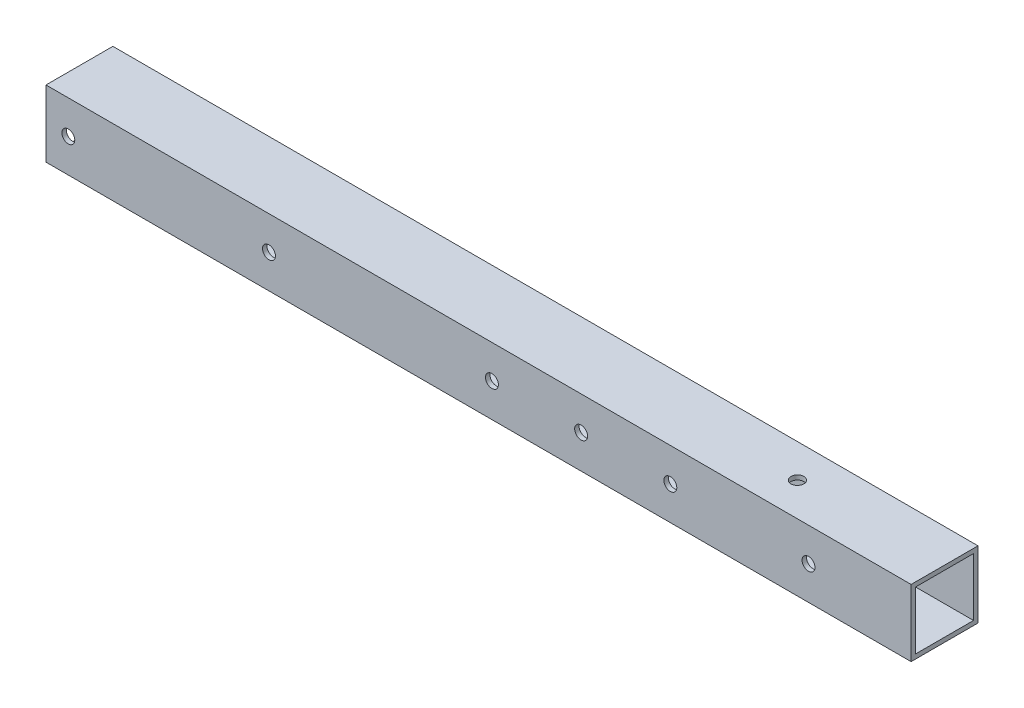
ISO-10303-21;
HEADER;
FILE_DESCRIPTION(('STEP AP214'),'2;1');
FILE_NAME('part.step','',(''),(''),'','','');
FILE_SCHEMA(('AUTOMOTIVE_DESIGN { 1 0 10303 214 1 1 1 1 }'));
ENDSEC;
DATA;
#1=APPLICATION_CONTEXT('core data for automotive mechanical design processes');
#2=APPLICATION_PROTOCOL_DEFINITION('international standard','automotive_design',2000,#1);
#3=PRODUCT_CONTEXT('',#1,'mechanical');
#4=PRODUCT('Part','Part','',(#3));
#5=PRODUCT_RELATED_PRODUCT_CATEGORY('part','',(#4));
#6=PRODUCT_DEFINITION_FORMATION('','',#4);
#7=PRODUCT_DEFINITION_CONTEXT('part definition',#1,'design');
#8=PRODUCT_DEFINITION('design','',#6,#7);
#9=PRODUCT_DEFINITION_SHAPE('','',#8);
#10=(LENGTH_UNIT() NAMED_UNIT(*) SI_UNIT(.MILLI.,.METRE.));
#11=(NAMED_UNIT(*) PLANE_ANGLE_UNIT() SI_UNIT($,.RADIAN.));
#12=(NAMED_UNIT(*) SI_UNIT($,.STERADIAN.) SOLID_ANGLE_UNIT());
#13=UNCERTAINTY_MEASURE_WITH_UNIT(LENGTH_MEASURE(1.E-05),#10,'distance_accuracy_value','');
#14=(GEOMETRIC_REPRESENTATION_CONTEXT(3) GLOBAL_UNCERTAINTY_ASSIGNED_CONTEXT((#13)) GLOBAL_UNIT_ASSIGNED_CONTEXT((#10,
#11,#12)) REPRESENTATION_CONTEXT('',''));
#15=CARTESIAN_POINT('',(0.,0.,0.));
#16=DIRECTION('',(0.,0.,1.));
#17=DIRECTION('',(1.,0.,0.));
#18=AXIS2_PLACEMENT_3D('',#15,#16,#17);
#19=CARTESIAN_POINT('',(194.,-6.50000000000001,-6.49999999999999));
#20=DIRECTION('',(0.,0.,1.));
#21=DIRECTION('',(1.,0.,0.));
#22=AXIS2_PLACEMENT_3D('',#19,#20,#21);
#23=PLANE('',#22);
#24=CARTESIAN_POINT('',(100.,0.,-6.49999999999999));
#25=DIRECTION('',(0.,0.,1.));
#26=DIRECTION('',(1.,0.,0.));
#27=AXIS2_PLACEMENT_3D('',#24,#25,#26);
#28=CIRCLE('',#27,1.45);
#29=CARTESIAN_POINT('',(101.45,0.,-6.49999999999999));
#30=VERTEX_POINT('',#29);
#31=EDGE_CURVE('E293',#30,#30,#28,.T.);
#32=ORIENTED_EDGE('',*,*,#31,.F.);
#33=EDGE_LOOP('',(#32));
#34=FACE_BOUND('',#33,.T.);
#35=CARTESIAN_POINT('',(140.,0.,-6.49999999999999));
#36=DIRECTION('',(0.,0.,1.));
#37=DIRECTION('',(1.,0.,0.));
#38=AXIS2_PLACEMENT_3D('',#35,#36,#37);
#39=CIRCLE('',#38,1.45);
#40=CARTESIAN_POINT('',(141.45,0.,-6.49999999999999));
#41=VERTEX_POINT('',#40);
#42=EDGE_CURVE('E304',#41,#41,#39,.T.);
#43=ORIENTED_EDGE('',*,*,#42,.F.);
#44=EDGE_LOOP('',(#43));
#45=FACE_BOUND('',#44,.T.);
#46=CARTESIAN_POINT('',(120.,0.,-6.49999999999999));
#47=DIRECTION('',(0.,0.,1.));
#48=DIRECTION('',(1.,0.,0.));
#49=AXIS2_PLACEMENT_3D('',#46,#47,#48);
#50=CIRCLE('',#49,1.45);
#51=CARTESIAN_POINT('',(121.45,0.,-6.49999999999999));
#52=VERTEX_POINT('',#51);
#53=EDGE_CURVE('E312',#52,#52,#50,.T.);
#54=ORIENTED_EDGE('',*,*,#53,.F.);
#55=EDGE_LOOP('',(#54));
#56=FACE_BOUND('',#55,.T.);
#57=CARTESIAN_POINT('',(171.,0.,-6.49999999999999));
#58=DIRECTION('',(0.,0.,1.));
#59=DIRECTION('',(1.,0.,0.));
#60=AXIS2_PLACEMENT_3D('',#57,#58,#59);
#61=CIRCLE('',#60,1.45);
#62=CARTESIAN_POINT('',(172.45,0.,-6.49999999999999));
#63=VERTEX_POINT('',#62);
#64=EDGE_CURVE('E258',#63,#63,#61,.T.);
#65=ORIENTED_EDGE('',*,*,#64,.F.);
#66=EDGE_LOOP('',(#65));
#67=FACE_BOUND('',#66,.T.);
#68=CARTESIAN_POINT('',(5.,0.,-6.49999999999999));
#69=DIRECTION('',(0.,0.,1.));
#70=DIRECTION('',(1.,0.,0.));
#71=AXIS2_PLACEMENT_3D('',#68,#69,#70);
#72=CIRCLE('',#71,1.45);
#73=CARTESIAN_POINT('',(6.45,0.,-6.49999999999999));
#74=VERTEX_POINT('',#73);
#75=EDGE_CURVE('E168',#74,#74,#72,.T.);
#76=ORIENTED_EDGE('',*,*,#75,.F.);
#77=EDGE_LOOP('',(#76));
#78=FACE_BOUND('',#77,.T.);
#79=CARTESIAN_POINT('',(50.,0.,-6.49999999999999));
#80=DIRECTION('',(0.,0.,1.));
#81=DIRECTION('',(1.,0.,0.));
#82=AXIS2_PLACEMENT_3D('',#79,#80,#81);
#83=CIRCLE('',#82,1.45);
#84=CARTESIAN_POINT('',(51.45,0.,-6.49999999999999));
#85=VERTEX_POINT('',#84);
#86=EDGE_CURVE('E244',#85,#85,#83,.T.);
#87=ORIENTED_EDGE('',*,*,#86,.F.);
#88=EDGE_LOOP('',(#87));
#89=FACE_BOUND('',#88,.T.);
#90=DIRECTION('',(0.,1.,0.));
#91=VECTOR('',#90,1.);
#92=CARTESIAN_POINT('',(0.,-6.50000000000001,-6.49999999999999));
#93=LINE('',#92,#91);
#94=CARTESIAN_POINT('',(0.,-6.50000000000001,-6.49999999999999));
#95=VERTEX_POINT('',#94);
#96=CARTESIAN_POINT('',(0.,6.49999999999999,-6.49999999999999));
#97=VERTEX_POINT('',#96);
#98=EDGE_CURVE('E177',#95,#97,#93,.T.);
#99=ORIENTED_EDGE('',*,*,#98,.F.);
#100=DIRECTION('',(-1.,0.,0.));
#101=VECTOR('',#100,1.);
#102=CARTESIAN_POINT('',(194.,-6.50000000000001,-6.49999999999999));
#103=LINE('',#102,#101);
#104=CARTESIAN_POINT('',(194.,-6.50000000000001,-6.49999999999999));
#105=VERTEX_POINT('',#104);
#106=EDGE_CURVE('E12',#105,#95,#103,.T.);
#107=ORIENTED_EDGE('',*,*,#106,.F.);
#108=DIRECTION('',(0.,1.,0.));
#109=VECTOR('',#108,1.);
#110=CARTESIAN_POINT('',(194.,-6.50000000000001,-6.49999999999999));
#111=LINE('',#110,#109);
#112=CARTESIAN_POINT('',(194.,6.49999999999999,-6.49999999999999));
#113=VERTEX_POINT('',#112);
#114=EDGE_CURVE('E151',#105,#113,#111,.T.);
#115=ORIENTED_EDGE('',*,*,#114,.T.);
#116=DIRECTION('',(-1.,0.,0.));
#117=VECTOR('',#116,1.);
#118=CARTESIAN_POINT('',(194.,6.49999999999999,-6.49999999999999));
#119=LINE('',#118,#117);
#120=EDGE_CURVE('E81',#113,#97,#119,.T.);
#121=ORIENTED_EDGE('',*,*,#120,.T.);
#122=EDGE_LOOP('',(#99,#107,#115,#121));
#123=FACE_BOUND('',#122,.T.);
#124=ADVANCED_FACE('F61',(#34,#45,#56,#67,#78,#89,#123),#23,.T.);
#125=CARTESIAN_POINT('',(194.,-6.50000000000001,6.50000000000001));
#126=DIRECTION('',(0.,1.,0.));
#127=DIRECTION('',(0.,0.,1.));
#128=AXIS2_PLACEMENT_3D('',#125,#126,#127);
#129=PLANE('',#128);
#130=CARTESIAN_POINT('',(161.,-6.50000000000001,0.));
#131=DIRECTION('',(0.,1.,0.));
#132=DIRECTION('',(0.,0.,1.));
#133=AXIS2_PLACEMENT_3D('',#130,#131,#132);
#134=CIRCLE('',#133,1.45);
#135=CARTESIAN_POINT('',(161.,-6.50000000000001,1.45));
#136=VERTEX_POINT('',#135);
#137=EDGE_CURVE('E281',#136,#136,#134,.T.);
#138=ORIENTED_EDGE('',*,*,#137,.F.);
#139=EDGE_LOOP('',(#138));
#140=FACE_BOUND('',#139,.T.);
#141=DIRECTION('',(0.,0.,-1.));
#142=VECTOR('',#141,1.);
#143=CARTESIAN_POINT('',(0.,-6.50000000000001,6.50000000000001));
#144=LINE('',#143,#142);
#145=CARTESIAN_POINT('',(0.,-6.50000000000001,6.50000000000001));
#146=VERTEX_POINT('',#145);
#147=EDGE_CURVE('E139',#146,#95,#144,.T.);
#148=ORIENTED_EDGE('',*,*,#147,.F.);
#149=DIRECTION('',(-1.,0.,0.));
#150=VECTOR('',#149,1.);
#151=CARTESIAN_POINT('',(194.,-6.50000000000001,6.50000000000001));
#152=LINE('',#151,#150);
#153=CARTESIAN_POINT('',(194.,-6.50000000000001,6.50000000000001));
#154=VERTEX_POINT('',#153);
#155=EDGE_CURVE('E72',#154,#146,#152,.T.);
#156=ORIENTED_EDGE('',*,*,#155,.F.);
#157=DIRECTION('',(0.,0.,-1.));
#158=VECTOR('',#157,1.);
#159=CARTESIAN_POINT('',(194.,-6.50000000000001,6.50000000000001));
#160=LINE('',#159,#158);
#161=EDGE_CURVE('E137',#154,#105,#160,.T.);
#162=ORIENTED_EDGE('',*,*,#161,.T.);
#163=ORIENTED_EDGE('',*,*,#106,.T.);
#164=EDGE_LOOP('',(#148,#156,#162,#163));
#165=FACE_BOUND('',#164,.T.);
#166=ADVANCED_FACE('F136',(#140,#165),#129,.T.);
#167=CARTESIAN_POINT('',(194.,-6.50000000000001,6.50000000000001));
#168=DIRECTION('',(0.,0.,-1.));
#169=DIRECTION('',(-1.,0.,0.));
#170=AXIS2_PLACEMENT_3D('',#167,#168,#169);
#171=PLANE('',#170);
#172=CARTESIAN_POINT('',(100.,0.,6.50000000000001));
#173=DIRECTION('',(0.,0.,-1.));
#174=DIRECTION('',(-1.,0.,0.));
#175=AXIS2_PLACEMENT_3D('',#172,#173,#174);
#176=CIRCLE('',#175,1.45);
#177=CARTESIAN_POINT('',(98.55,0.,6.50000000000001));
#178=VERTEX_POINT('',#177);
#179=EDGE_CURVE('E300',#178,#178,#176,.T.);
#180=ORIENTED_EDGE('',*,*,#179,.F.);
#181=EDGE_LOOP('',(#180));
#182=FACE_BOUND('',#181,.T.);
#183=CARTESIAN_POINT('',(140.,0.,6.50000000000001));
#184=DIRECTION('',(0.,0.,-1.));
#185=DIRECTION('',(-1.,0.,0.));
#186=AXIS2_PLACEMENT_3D('',#183,#184,#185);
#187=CIRCLE('',#186,1.45);
#188=CARTESIAN_POINT('',(138.55,0.,6.50000000000001));
#189=VERTEX_POINT('',#188);
#190=EDGE_CURVE('E308',#189,#189,#187,.T.);
#191=ORIENTED_EDGE('',*,*,#190,.F.);
#192=EDGE_LOOP('',(#191));
#193=FACE_BOUND('',#192,.T.);
#194=CARTESIAN_POINT('',(120.,0.,6.50000000000001));
#195=DIRECTION('',(0.,0.,-1.));
#196=DIRECTION('',(-1.,0.,0.));
#197=AXIS2_PLACEMENT_3D('',#194,#195,#196);
#198=CIRCLE('',#197,1.45);
#199=CARTESIAN_POINT('',(118.55,0.,6.50000000000001));
#200=VERTEX_POINT('',#199);
#201=EDGE_CURVE('E316',#200,#200,#198,.T.);
#202=ORIENTED_EDGE('',*,*,#201,.F.);
#203=EDGE_LOOP('',(#202));
#204=FACE_BOUND('',#203,.T.);
#205=CARTESIAN_POINT('',(171.,0.,6.50000000000001));
#206=DIRECTION('',(0.,0.,-1.));
#207=DIRECTION('',(-1.,0.,0.));
#208=AXIS2_PLACEMENT_3D('',#205,#206,#207);
#209=CIRCLE('',#208,1.45);
#210=CARTESIAN_POINT('',(169.55,0.,6.50000000000001));
#211=VERTEX_POINT('',#210);
#212=EDGE_CURVE('E272',#211,#211,#209,.T.);
#213=ORIENTED_EDGE('',*,*,#212,.F.);
#214=EDGE_LOOP('',(#213));
#215=FACE_BOUND('',#214,.T.);
#216=CARTESIAN_POINT('',(5.,0.,6.50000000000001));
#217=DIRECTION('',(0.,0.,-1.));
#218=DIRECTION('',(-1.,0.,0.));
#219=AXIS2_PLACEMENT_3D('',#216,#217,#218);
#220=CIRCLE('',#219,1.45);
#221=CARTESIAN_POINT('',(3.55,0.,6.50000000000001));
#222=VERTEX_POINT('',#221);
#223=EDGE_CURVE('E240',#222,#222,#220,.T.);
#224=ORIENTED_EDGE('',*,*,#223,.F.);
#225=EDGE_LOOP('',(#224));
#226=FACE_BOUND('',#225,.T.);
#227=CARTESIAN_POINT('',(50.,0.,6.50000000000001));
#228=DIRECTION('',(0.,0.,-1.));
#229=DIRECTION('',(-1.,0.,0.));
#230=AXIS2_PLACEMENT_3D('',#227,#228,#229);
#231=CIRCLE('',#230,1.45);
#232=CARTESIAN_POINT('',(48.55,0.,6.50000000000001));
#233=VERTEX_POINT('',#232);
#234=EDGE_CURVE('E248',#233,#233,#231,.T.);
#235=ORIENTED_EDGE('',*,*,#234,.F.);
#236=EDGE_LOOP('',(#235));
#237=FACE_BOUND('',#236,.T.);
#238=DIRECTION('',(0.,-1.,0.));
#239=VECTOR('',#238,1.);
#240=CARTESIAN_POINT('',(0.,-6.50000000000001,6.50000000000001));
#241=LINE('',#240,#239);
#242=CARTESIAN_POINT('',(0.,6.49999999999999,6.50000000000001));
#243=VERTEX_POINT('',#242);
#244=EDGE_CURVE('E182',#243,#146,#241,.T.);
#245=ORIENTED_EDGE('',*,*,#244,.F.);
#246=DIRECTION('',(-1.,0.,0.));
#247=VECTOR('',#246,1.);
#248=CARTESIAN_POINT('',(194.,6.49999999999999,6.50000000000001));
#249=LINE('',#248,#247);
#250=CARTESIAN_POINT('',(194.,6.49999999999999,6.50000000000001));
#251=VERTEX_POINT('',#250);
#252=EDGE_CURVE('E106',#251,#243,#249,.T.);
#253=ORIENTED_EDGE('',*,*,#252,.F.);
#254=DIRECTION('',(0.,-1.,0.));
#255=VECTOR('',#254,1.);
#256=CARTESIAN_POINT('',(194.,-6.50000000000001,6.50000000000001));
#257=LINE('',#256,#255);
#258=EDGE_CURVE('E150',#251,#154,#257,.T.);
#259=ORIENTED_EDGE('',*,*,#258,.T.);
#260=ORIENTED_EDGE('',*,*,#155,.T.);
#261=EDGE_LOOP('',(#245,#253,#259,#260));
#262=FACE_BOUND('',#261,.T.);
#263=ADVANCED_FACE('F154',(#182,#193,#204,#215,#226,#237,#262),#171,.T.);
#264=CARTESIAN_POINT('',(194.,-7.50000000000001,-7.49999999999999));
#265=DIRECTION('',(0.,0.,1.));
#266=DIRECTION('',(1.,0.,0.));
#267=AXIS2_PLACEMENT_3D('',#264,#265,#266);
#268=PLANE('',#267);
#269=CARTESIAN_POINT('',(100.,0.,-7.49999999999999));
#270=DIRECTION('',(0.,0.,-1.));
#271=DIRECTION('',(-1.,0.,0.));
#272=AXIS2_PLACEMENT_3D('',#269,#270,#271);
#273=CIRCLE('',#272,1.45);
#274=CARTESIAN_POINT('',(98.55,0.,-7.49999999999999));
#275=VERTEX_POINT('',#274);
#276=EDGE_CURVE('E333',#275,#275,#273,.T.);
#277=ORIENTED_EDGE('',*,*,#276,.F.);
#278=EDGE_LOOP('',(#277));
#279=FACE_BOUND('',#278,.T.);
#280=CARTESIAN_POINT('',(140.,0.,-7.49999999999999));
#281=DIRECTION('',(0.,0.,-1.));
#282=DIRECTION('',(-1.,0.,0.));
#283=AXIS2_PLACEMENT_3D('',#280,#281,#282);
#284=CIRCLE('',#283,1.45);
#285=CARTESIAN_POINT('',(138.55,0.,-7.49999999999999));
#286=VERTEX_POINT('',#285);
#287=EDGE_CURVE('E325',#286,#286,#284,.T.);
#288=ORIENTED_EDGE('',*,*,#287,.F.);
#289=EDGE_LOOP('',(#288));
#290=FACE_BOUND('',#289,.T.);
#291=CARTESIAN_POINT('',(120.,0.,-7.49999999999999));
#292=DIRECTION('',(0.,0.,-1.));
#293=DIRECTION('',(-1.,0.,0.));
#294=AXIS2_PLACEMENT_3D('',#291,#292,#293);
#295=CIRCLE('',#294,1.45);
#296=CARTESIAN_POINT('',(118.55,0.,-7.49999999999999));
#297=VERTEX_POINT('',#296);
#298=EDGE_CURVE('E321',#297,#297,#295,.T.);
#299=ORIENTED_EDGE('',*,*,#298,.F.);
#300=EDGE_LOOP('',(#299));
#301=FACE_BOUND('',#300,.T.);
#302=CARTESIAN_POINT('',(171.,0.,-7.49999999999999));
#303=DIRECTION('',(0.,0.,-1.));
#304=DIRECTION('',(-1.,0.,0.));
#305=AXIS2_PLACEMENT_3D('',#302,#303,#304);
#306=CIRCLE('',#305,1.45);
#307=CARTESIAN_POINT('',(169.55,0.,-7.49999999999999));
#308=VERTEX_POINT('',#307);
#309=EDGE_CURVE('E277',#308,#308,#306,.T.);
#310=ORIENTED_EDGE('',*,*,#309,.F.);
#311=EDGE_LOOP('',(#310));
#312=FACE_BOUND('',#311,.T.);
#313=CARTESIAN_POINT('',(5.,0.,-7.49999999999999));
#314=DIRECTION('',(0.,0.,-1.));
#315=DIRECTION('',(-1.,0.,0.));
#316=AXIS2_PLACEMENT_3D('',#313,#314,#315);
#317=CIRCLE('',#316,1.45);
#318=CARTESIAN_POINT('',(3.55,0.,-7.49999999999999));
#319=VERTEX_POINT('',#318);
#320=EDGE_CURVE('E262',#319,#319,#317,.T.);
#321=ORIENTED_EDGE('',*,*,#320,.F.);
#322=EDGE_LOOP('',(#321));
#323=FACE_BOUND('',#322,.T.);
#324=CARTESIAN_POINT('',(50.,0.,-7.49999999999999));
#325=DIRECTION('',(0.,0.,-1.));
#326=DIRECTION('',(-1.,0.,0.));
#327=AXIS2_PLACEMENT_3D('',#324,#325,#326);
#328=CIRCLE('',#327,1.45);
#329=CARTESIAN_POINT('',(48.55,0.,-7.49999999999999));
#330=VERTEX_POINT('',#329);
#331=EDGE_CURVE('E257',#330,#330,#328,.T.);
#332=ORIENTED_EDGE('',*,*,#331,.F.);
#333=EDGE_LOOP('',(#332));
#334=FACE_BOUND('',#333,.T.);
#335=DIRECTION('',(0.,1.,0.));
#336=VECTOR('',#335,1.);
#337=CARTESIAN_POINT('',(0.,-7.50000000000001,-7.49999999999999));
#338=LINE('',#337,#336);
#339=CARTESIAN_POINT('',(0.,-7.50000000000001,-7.49999999999999));
#340=VERTEX_POINT('',#339);
#341=CARTESIAN_POINT('',(0.,7.49999999999999,-7.49999999999999));
#342=VERTEX_POINT('',#341);
#343=EDGE_CURVE('E163',#340,#342,#338,.T.);
#344=ORIENTED_EDGE('',*,*,#343,.T.);
#345=DIRECTION('',(-1.,0.,0.));
#346=VECTOR('',#345,1.);
#347=CARTESIAN_POINT('',(194.,7.49999999999999,-7.49999999999999));
#348=LINE('',#347,#346);
#349=CARTESIAN_POINT('',(194.,7.49999999999999,-7.49999999999999));
#350=VERTEX_POINT('',#349);
#351=EDGE_CURVE('E192',#350,#342,#348,.T.);
#352=ORIENTED_EDGE('',*,*,#351,.F.);
#353=DIRECTION('',(0.,1.,0.));
#354=VECTOR('',#353,1.);
#355=CARTESIAN_POINT('',(194.,-7.50000000000001,-7.49999999999999));
#356=LINE('',#355,#354);
#357=CARTESIAN_POINT('',(194.,-7.50000000000001,-7.49999999999999));
#358=VERTEX_POINT('',#357);
#359=EDGE_CURVE('E189',#358,#350,#356,.T.);
#360=ORIENTED_EDGE('',*,*,#359,.F.);
#361=DIRECTION('',(-1.,0.,0.));
#362=VECTOR('',#361,1.);
#363=CARTESIAN_POINT('',(194.,-7.50000000000001,-7.49999999999999));
#364=LINE('',#363,#362);
#365=EDGE_CURVE('E159',#358,#340,#364,.T.);
#366=ORIENTED_EDGE('',*,*,#365,.T.);
#367=EDGE_LOOP('',(#344,#352,#360,#366));
#368=FACE_BOUND('',#367,.T.);
#369=ADVANCED_FACE('F63',(#279,#290,#301,#312,#323,#334,#368),#268,.F.);
#370=CARTESIAN_POINT('',(194.,7.49999999999999,7.50000000000001));
#371=DIRECTION('',(0.,-1.,0.));
#372=DIRECTION('',(0.,0.,-1.));
#373=AXIS2_PLACEMENT_3D('',#370,#371,#372);
#374=PLANE('',#373);
#375=CARTESIAN_POINT('',(161.,7.49999999999999,0.));
#376=DIRECTION('',(0.,1.,0.));
#377=DIRECTION('',(0.,0.,1.));
#378=AXIS2_PLACEMENT_3D('',#375,#376,#377);
#379=CIRCLE('',#378,1.45);
#380=CARTESIAN_POINT('',(161.,7.49999999999999,1.45));
#381=VERTEX_POINT('',#380);
#382=EDGE_CURVE('E288',#381,#381,#379,.T.);
#383=ORIENTED_EDGE('',*,*,#382,.F.);
#384=EDGE_LOOP('',(#383));
#385=FACE_BOUND('',#384,.T.);
#386=DIRECTION('',(0.,0.,1.));
#387=VECTOR('',#386,1.);
#388=CARTESIAN_POINT('',(0.,7.49999999999999,7.50000000000001));
#389=LINE('',#388,#387);
#390=CARTESIAN_POINT('',(0.,7.49999999999999,7.50000000000001));
#391=VERTEX_POINT('',#390);
#392=EDGE_CURVE('E167',#342,#391,#389,.T.);
#393=ORIENTED_EDGE('',*,*,#392,.T.);
#394=DIRECTION('',(-1.,0.,0.));
#395=VECTOR('',#394,1.);
#396=CARTESIAN_POINT('',(194.,7.49999999999999,7.50000000000001));
#397=LINE('',#396,#395);
#398=CARTESIAN_POINT('',(194.,7.49999999999999,7.50000000000001));
#399=VERTEX_POINT('',#398);
#400=EDGE_CURVE('E202',#399,#391,#397,.T.);
#401=ORIENTED_EDGE('',*,*,#400,.F.);
#402=DIRECTION('',(0.,0.,1.));
#403=VECTOR('',#402,1.);
#404=CARTESIAN_POINT('',(194.,7.49999999999999,7.50000000000001));
#405=LINE('',#404,#403);
#406=EDGE_CURVE('E119',#350,#399,#405,.T.);
#407=ORIENTED_EDGE('',*,*,#406,.F.);
#408=ORIENTED_EDGE('',*,*,#351,.T.);
#409=EDGE_LOOP('',(#393,#401,#407,#408));
#410=FACE_BOUND('',#409,.T.);
#411=ADVANCED_FACE('F207',(#385,#410),#374,.F.);
#412=CARTESIAN_POINT('',(194.,-7.50000000000001,7.49999999999999));
#413=DIRECTION('',(0.,0.,-1.));
#414=DIRECTION('',(0.,1.,0.));
#415=AXIS2_PLACEMENT_3D('',#412,#413,#414);
#416=PLANE('',#415);
#417=CARTESIAN_POINT('',(100.,0.,7.50000000000001));
#418=DIRECTION('',(0.,0.,-1.));
#419=DIRECTION('',(-1.,0.,0.));
#420=AXIS2_PLACEMENT_3D('',#417,#418,#419);
#421=CIRCLE('',#420,1.45);
#422=CARTESIAN_POINT('',(98.55,0.,7.50000000000001));
#423=VERTEX_POINT('',#422);
#424=EDGE_CURVE('E329',#423,#423,#421,.T.);
#425=ORIENTED_EDGE('',*,*,#424,.T.);
#426=EDGE_LOOP('',(#425));
#427=FACE_BOUND('',#426,.T.);
#428=CARTESIAN_POINT('',(140.,0.,7.50000000000001));
#429=DIRECTION('',(0.,0.,-1.));
#430=DIRECTION('',(-1.,0.,0.));
#431=AXIS2_PLACEMENT_3D('',#428,#429,#430);
#432=CIRCLE('',#431,1.45);
#433=CARTESIAN_POINT('',(138.55,0.,7.50000000000001));
#434=VERTEX_POINT('',#433);
#435=EDGE_CURVE('E337',#434,#434,#432,.T.);
#436=ORIENTED_EDGE('',*,*,#435,.T.);
#437=EDGE_LOOP('',(#436));
#438=FACE_BOUND('',#437,.T.);
#439=CARTESIAN_POINT('',(120.,0.,7.50000000000001));
#440=DIRECTION('',(0.,0.,-1.));
#441=DIRECTION('',(-1.,0.,0.));
#442=AXIS2_PLACEMENT_3D('',#439,#440,#441);
#443=CIRCLE('',#442,1.45);
#444=CARTESIAN_POINT('',(118.55,0.,7.50000000000001));
#445=VERTEX_POINT('',#444);
#446=EDGE_CURVE('E320',#445,#445,#443,.T.);
#447=ORIENTED_EDGE('',*,*,#446,.T.);
#448=EDGE_LOOP('',(#447));
#449=FACE_BOUND('',#448,.T.);
#450=CARTESIAN_POINT('',(171.,0.,7.50000000000001));
#451=DIRECTION('',(0.,0.,-1.));
#452=DIRECTION('',(-1.,0.,0.));
#453=AXIS2_PLACEMENT_3D('',#450,#451,#452);
#454=CIRCLE('',#453,1.45);
#455=CARTESIAN_POINT('',(169.55,0.,7.50000000000001));
#456=VERTEX_POINT('',#455);
#457=EDGE_CURVE('E276',#456,#456,#454,.T.);
#458=ORIENTED_EDGE('',*,*,#457,.T.);
#459=EDGE_LOOP('',(#458));
#460=FACE_BOUND('',#459,.T.);
#461=CARTESIAN_POINT('',(5.,0.,7.50000000000001));
#462=DIRECTION('',(0.,0.,-1.));
#463=DIRECTION('',(-1.,0.,0.));
#464=AXIS2_PLACEMENT_3D('',#461,#462,#463);
#465=CIRCLE('',#464,1.45);
#466=CARTESIAN_POINT('',(3.55,0.,7.50000000000001));
#467=VERTEX_POINT('',#466);
#468=EDGE_CURVE('E252',#467,#467,#465,.T.);
#469=ORIENTED_EDGE('',*,*,#468,.T.);
#470=EDGE_LOOP('',(#469));
#471=FACE_BOUND('',#470,.T.);
#472=CARTESIAN_POINT('',(50.,0.,7.50000000000001));
#473=DIRECTION('',(0.,0.,-1.));
#474=DIRECTION('',(-1.,0.,0.));
#475=AXIS2_PLACEMENT_3D('',#472,#473,#474);
#476=CIRCLE('',#475,1.45);
#477=CARTESIAN_POINT('',(48.55,0.,7.50000000000001));
#478=VERTEX_POINT('',#477);
#479=EDGE_CURVE('E253',#478,#478,#476,.T.);
#480=ORIENTED_EDGE('',*,*,#479,.T.);
#481=EDGE_LOOP('',(#480));
#482=FACE_BOUND('',#481,.T.);
#483=DIRECTION('',(0.,-1.,0.));
#484=VECTOR('',#483,1.);
#485=CARTESIAN_POINT('',(0.,-7.50000000000001,7.49999999999999));
#486=LINE('',#485,#484);
#487=CARTESIAN_POINT('',(0.,-7.50000000000001,7.49999999999999));
#488=VERTEX_POINT('',#487);
#489=EDGE_CURVE('E171',#391,#488,#486,.T.);
#490=ORIENTED_EDGE('',*,*,#489,.T.);
#491=DIRECTION('',(-1.,0.,0.));
#492=VECTOR('',#491,1.);
#493=CARTESIAN_POINT('',(194.,-7.50000000000001,7.49999999999999));
#494=LINE('',#493,#492);
#495=CARTESIAN_POINT('',(194.,-7.50000000000001,7.49999999999999));
#496=VERTEX_POINT('',#495);
#497=EDGE_CURVE('E198',#496,#488,#494,.T.);
#498=ORIENTED_EDGE('',*,*,#497,.F.);
#499=DIRECTION('',(0.,-1.,0.));
#500=VECTOR('',#499,1.);
#501=CARTESIAN_POINT('',(194.,-7.50000000000001,7.49999999999999));
#502=LINE('',#501,#500);
#503=EDGE_CURVE('E227',#399,#496,#502,.T.);
#504=ORIENTED_EDGE('',*,*,#503,.F.);
#505=ORIENTED_EDGE('',*,*,#400,.T.);
#506=EDGE_LOOP('',(#490,#498,#504,#505));
#507=FACE_BOUND('',#506,.T.);
#508=ADVANCED_FACE('F219',(#427,#438,#449,#460,#471,#482,#507),#416,.F.);
#509=CARTESIAN_POINT('',(194.,-7.50000000000001,7.49999999999999));
#510=DIRECTION('',(0.,1.,0.));
#511=DIRECTION('',(0.,0.,1.));
#512=AXIS2_PLACEMENT_3D('',#509,#510,#511);
#513=PLANE('',#512);
#514=CARTESIAN_POINT('',(161.,-7.50000000000001,0.));
#515=DIRECTION('',(0.,1.,0.));
#516=DIRECTION('',(0.,0.,1.));
#517=AXIS2_PLACEMENT_3D('',#514,#515,#516);
#518=CIRCLE('',#517,1.45);
#519=CARTESIAN_POINT('',(161.,-7.50000000000001,1.45));
#520=VERTEX_POINT('',#519);
#521=EDGE_CURVE('E292',#520,#520,#518,.T.);
#522=ORIENTED_EDGE('',*,*,#521,.T.);
#523=EDGE_LOOP('',(#522));
#524=FACE_BOUND('',#523,.T.);
#525=DIRECTION('',(0.,0.,-1.));
#526=VECTOR('',#525,1.);
#527=CARTESIAN_POINT('',(0.,-7.50000000000001,7.49999999999999));
#528=LINE('',#527,#526);
#529=EDGE_CURVE('E174',#488,#340,#528,.T.);
#530=ORIENTED_EDGE('',*,*,#529,.T.);
#531=ORIENTED_EDGE('',*,*,#365,.F.);
#532=DIRECTION('',(0.,0.,-1.));
#533=VECTOR('',#532,1.);
#534=CARTESIAN_POINT('',(194.,-7.50000000000001,7.49999999999999));
#535=LINE('',#534,#533);
#536=EDGE_CURVE('E224',#496,#358,#535,.T.);
#537=ORIENTED_EDGE('',*,*,#536,.F.);
#538=ORIENTED_EDGE('',*,*,#497,.T.);
#539=EDGE_LOOP('',(#530,#531,#537,#538));
#540=FACE_BOUND('',#539,.T.);
#541=ADVANCED_FACE('F223',(#524,#540),#513,.F.);
#542=CARTESIAN_POINT('',(194.,6.49999999999999,6.50000000000001));
#543=DIRECTION('',(0.,-1.,0.));
#544=DIRECTION('',(0.,0.,-1.));
#545=AXIS2_PLACEMENT_3D('',#542,#543,#544);
#546=PLANE('',#545);
#547=CARTESIAN_POINT('',(161.,6.49999999999999,0.));
#548=DIRECTION('',(0.,-1.,0.));
#549=DIRECTION('',(0.,0.,-1.));
#550=AXIS2_PLACEMENT_3D('',#547,#548,#549);
#551=CIRCLE('',#550,1.45);
#552=CARTESIAN_POINT('',(161.,6.49999999999999,-1.45));
#553=VERTEX_POINT('',#552);
#554=EDGE_CURVE('E65',#553,#553,#551,.T.);
#555=ORIENTED_EDGE('',*,*,#554,.F.);
#556=EDGE_LOOP('',(#555));
#557=FACE_BOUND('',#556,.T.);
#558=DIRECTION('',(0.,0.,1.));
#559=VECTOR('',#558,1.);
#560=CARTESIAN_POINT('',(0.,6.49999999999999,6.50000000000001));
#561=LINE('',#560,#559);
#562=EDGE_CURVE('E185',#97,#243,#561,.T.);
#563=ORIENTED_EDGE('',*,*,#562,.F.);
#564=ORIENTED_EDGE('',*,*,#120,.F.);
#565=DIRECTION('',(0.,0.,1.));
#566=VECTOR('',#565,1.);
#567=CARTESIAN_POINT('',(194.,6.49999999999999,6.50000000000001));
#568=LINE('',#567,#566);
#569=EDGE_CURVE('E156',#113,#251,#568,.T.);
#570=ORIENTED_EDGE('',*,*,#569,.T.);
#571=ORIENTED_EDGE('',*,*,#252,.T.);
#572=EDGE_LOOP('',(#563,#564,#570,#571));
#573=FACE_BOUND('',#572,.T.);
#574=ADVANCED_FACE('F392',(#557,#573),#546,.T.);
#575=CARTESIAN_POINT('',(194.,0.,0.));
#576=DIRECTION('',(-1.,0.,0.));
#577=DIRECTION('',(0.,0.,1.));
#578=AXIS2_PLACEMENT_3D('',#575,#576,#577);
#579=PLANE('',#578);
#580=ORIENTED_EDGE('',*,*,#359,.T.);
#581=ORIENTED_EDGE('',*,*,#406,.T.);
#582=ORIENTED_EDGE('',*,*,#503,.T.);
#583=ORIENTED_EDGE('',*,*,#536,.T.);
#584=EDGE_LOOP('',(#580,#581,#582,#583));
#585=FACE_BOUND('',#584,.T.);
#586=ORIENTED_EDGE('',*,*,#114,.F.);
#587=ORIENTED_EDGE('',*,*,#161,.F.);
#588=ORIENTED_EDGE('',*,*,#258,.F.);
#589=ORIENTED_EDGE('',*,*,#569,.F.);
#590=EDGE_LOOP('',(#586,#587,#588,#589));
#591=FACE_BOUND('',#590,.T.);
#592=ADVANCED_FACE('F148',(#585,#591),#579,.F.);
#593=CARTESIAN_POINT('',(0.,0.,0.));
#594=DIRECTION('',(-1.,0.,0.));
#595=DIRECTION('',(0.,0.,1.));
#596=AXIS2_PLACEMENT_3D('',#593,#594,#595);
#597=PLANE('',#596);
#598=ORIENTED_EDGE('',*,*,#343,.F.);
#599=ORIENTED_EDGE('',*,*,#529,.F.);
#600=ORIENTED_EDGE('',*,*,#489,.F.);
#601=ORIENTED_EDGE('',*,*,#392,.F.);
#602=EDGE_LOOP('',(#598,#599,#600,#601));
#603=FACE_BOUND('',#602,.T.);
#604=ORIENTED_EDGE('',*,*,#98,.T.);
#605=ORIENTED_EDGE('',*,*,#562,.T.);
#606=ORIENTED_EDGE('',*,*,#244,.T.);
#607=ORIENTED_EDGE('',*,*,#147,.T.);
#608=EDGE_LOOP('',(#604,#605,#606,#607));
#609=FACE_BOUND('',#608,.T.);
#610=ADVANCED_FACE('F214',(#603,#609),#597,.T.);
#611=CARTESIAN_POINT('',(50.,0.,7.50000000000001));
#612=DIRECTION('',(0.,0.,-1.));
#613=DIRECTION('',(-1.,0.,0.));
#614=AXIS2_PLACEMENT_3D('',#611,#612,#613);
#615=CYLINDRICAL_SURFACE('',#614,1.45);
#616=ORIENTED_EDGE('',*,*,#234,.T.);
#617=EDGE_LOOP('',(#616));
#618=FACE_BOUND('',#617,.T.);
#619=ORIENTED_EDGE('',*,*,#479,.F.);
#620=EDGE_LOOP('',(#619));
#621=FACE_BOUND('',#620,.T.);
#622=ADVANCED_FACE('F364',(#618,#621),#615,.F.);
#623=CARTESIAN_POINT('',(5.,0.,7.50000000000001));
#624=DIRECTION('',(0.,0.,-1.));
#625=DIRECTION('',(-1.,0.,0.));
#626=AXIS2_PLACEMENT_3D('',#623,#624,#625);
#627=CYLINDRICAL_SURFACE('',#626,1.45);
#628=ORIENTED_EDGE('',*,*,#223,.T.);
#629=EDGE_LOOP('',(#628));
#630=FACE_BOUND('',#629,.T.);
#631=ORIENTED_EDGE('',*,*,#468,.F.);
#632=EDGE_LOOP('',(#631));
#633=FACE_BOUND('',#632,.T.);
#634=ADVANCED_FACE('F361',(#630,#633),#627,.F.);
#635=ORIENTED_EDGE('',*,*,#86,.T.);
#636=EDGE_LOOP('',(#635));
#637=FACE_BOUND('',#636,.T.);
#638=ORIENTED_EDGE('',*,*,#331,.T.);
#639=EDGE_LOOP('',(#638));
#640=FACE_BOUND('',#639,.T.);
#641=ADVANCED_FACE('F358',(#637,#640),#615,.F.);
#642=ORIENTED_EDGE('',*,*,#75,.T.);
#643=EDGE_LOOP('',(#642));
#644=FACE_BOUND('',#643,.T.);
#645=ORIENTED_EDGE('',*,*,#320,.T.);
#646=EDGE_LOOP('',(#645));
#647=FACE_BOUND('',#646,.T.);
#648=ADVANCED_FACE('F360',(#644,#647),#627,.F.);
#649=CARTESIAN_POINT('',(171.,0.,7.50000000000001));
#650=DIRECTION('',(0.,0.,-1.));
#651=DIRECTION('',(-1.,0.,0.));
#652=AXIS2_PLACEMENT_3D('',#649,#650,#651);
#653=CYLINDRICAL_SURFACE('',#652,1.45);
#654=ORIENTED_EDGE('',*,*,#212,.T.);
#655=EDGE_LOOP('',(#654));
#656=FACE_BOUND('',#655,.T.);
#657=ORIENTED_EDGE('',*,*,#457,.F.);
#658=EDGE_LOOP('',(#657));
#659=FACE_BOUND('',#658,.T.);
#660=ADVANCED_FACE('F369',(#656,#659),#653,.F.);
#661=ORIENTED_EDGE('',*,*,#64,.T.);
#662=EDGE_LOOP('',(#661));
#663=FACE_BOUND('',#662,.T.);
#664=ORIENTED_EDGE('',*,*,#309,.T.);
#665=EDGE_LOOP('',(#664));
#666=FACE_BOUND('',#665,.T.);
#667=ADVANCED_FACE('F405',(#663,#666),#653,.F.);
#668=CARTESIAN_POINT('',(161.,-7.50000000000001,0.));
#669=DIRECTION('',(0.,1.,0.));
#670=DIRECTION('',(0.,0.,1.));
#671=AXIS2_PLACEMENT_3D('',#668,#669,#670);
#672=CYLINDRICAL_SURFACE('',#671,1.45);
#673=ORIENTED_EDGE('',*,*,#554,.T.);
#674=EDGE_LOOP('',(#673));
#675=FACE_BOUND('',#674,.T.);
#676=ORIENTED_EDGE('',*,*,#382,.T.);
#677=EDGE_LOOP('',(#676));
#678=FACE_BOUND('',#677,.T.);
#679=ADVANCED_FACE('F402',(#675,#678),#672,.F.);
#680=ORIENTED_EDGE('',*,*,#137,.T.);
#681=EDGE_LOOP('',(#680));
#682=FACE_BOUND('',#681,.T.);
#683=ORIENTED_EDGE('',*,*,#521,.F.);
#684=EDGE_LOOP('',(#683));
#685=FACE_BOUND('',#684,.T.);
#686=ADVANCED_FACE('F404',(#682,#685),#672,.F.);
#687=CARTESIAN_POINT('',(120.,0.,7.50000000000001));
#688=DIRECTION('',(0.,0.,-1.));
#689=DIRECTION('',(-1.,0.,0.));
#690=AXIS2_PLACEMENT_3D('',#687,#688,#689);
#691=CYLINDRICAL_SURFACE('',#690,1.45);
#692=ORIENTED_EDGE('',*,*,#201,.T.);
#693=EDGE_LOOP('',(#692));
#694=FACE_BOUND('',#693,.T.);
#695=ORIENTED_EDGE('',*,*,#446,.F.);
#696=EDGE_LOOP('',(#695));
#697=FACE_BOUND('',#696,.T.);
#698=ADVANCED_FACE('F411',(#694,#697),#691,.F.);
#699=CARTESIAN_POINT('',(140.,0.,7.50000000000001));
#700=DIRECTION('',(0.,0.,-1.));
#701=DIRECTION('',(-1.,0.,0.));
#702=AXIS2_PLACEMENT_3D('',#699,#700,#701);
#703=CYLINDRICAL_SURFACE('',#702,1.45);
#704=ORIENTED_EDGE('',*,*,#190,.T.);
#705=EDGE_LOOP('',(#704));
#706=FACE_BOUND('',#705,.T.);
#707=ORIENTED_EDGE('',*,*,#435,.F.);
#708=EDGE_LOOP('',(#707));
#709=FACE_BOUND('',#708,.T.);
#710=ADVANCED_FACE('F506',(#706,#709),#703,.F.);
#711=CARTESIAN_POINT('',(100.,0.,7.50000000000001));
#712=DIRECTION('',(0.,0.,-1.));
#713=DIRECTION('',(-1.,0.,0.));
#714=AXIS2_PLACEMENT_3D('',#711,#712,#713);
#715=CYLINDRICAL_SURFACE('',#714,1.45);
#716=ORIENTED_EDGE('',*,*,#179,.T.);
#717=EDGE_LOOP('',(#716));
#718=FACE_BOUND('',#717,.T.);
#719=ORIENTED_EDGE('',*,*,#424,.F.);
#720=EDGE_LOOP('',(#719));
#721=FACE_BOUND('',#720,.T.);
#722=ADVANCED_FACE('F516',(#718,#721),#715,.F.);
#723=ORIENTED_EDGE('',*,*,#53,.T.);
#724=EDGE_LOOP('',(#723));
#725=FACE_BOUND('',#724,.T.);
#726=ORIENTED_EDGE('',*,*,#298,.T.);
#727=EDGE_LOOP('',(#726));
#728=FACE_BOUND('',#727,.T.);
#729=ADVANCED_FACE('F508',(#725,#728),#691,.F.);
#730=ORIENTED_EDGE('',*,*,#42,.T.);
#731=EDGE_LOOP('',(#730));
#732=FACE_BOUND('',#731,.T.);
#733=ORIENTED_EDGE('',*,*,#287,.T.);
#734=EDGE_LOOP('',(#733));
#735=FACE_BOUND('',#734,.T.);
#736=ADVANCED_FACE('F345',(#732,#735),#703,.F.);
#737=ORIENTED_EDGE('',*,*,#31,.T.);
#738=EDGE_LOOP('',(#737));
#739=FACE_BOUND('',#738,.T.);
#740=ORIENTED_EDGE('',*,*,#276,.T.);
#741=EDGE_LOOP('',(#740));
#742=FACE_BOUND('',#741,.T.);
#743=ADVANCED_FACE('F527',(#739,#742),#715,.F.);
#744=CLOSED_SHELL('',(#124,#166,#263,#369,#411,#508,#541,#574,#592,#610,#622,#634,#641,#648,
#660,#667,#679,#686,#698,#710,#722,#729,#736,#743));
#745=MANIFOLD_SOLID_BREP('B2',#744);
#746=ADVANCED_BREP_SHAPE_REPRESENTATION('',(#18,#745),#14);
#747=SHAPE_DEFINITION_REPRESENTATION(#9,#746);
ENDSEC;
END-ISO-10303-21;
